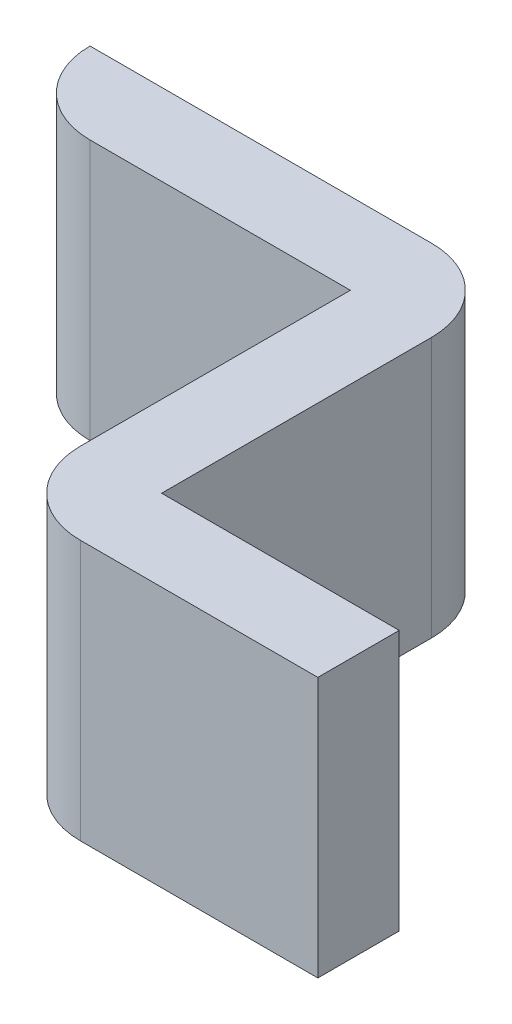
ISO-10303-21;
HEADER;
FILE_DESCRIPTION(('STEP AP214'),'2;1');
FILE_NAME('part.step','',(''),(''),'','','');
FILE_SCHEMA(('AUTOMOTIVE_DESIGN { 1 0 10303 214 1 1 1 1 }'));
ENDSEC;
DATA;
#1=APPLICATION_CONTEXT('core data for automotive mechanical design processes');
#2=APPLICATION_PROTOCOL_DEFINITION('international standard','automotive_design',2000,#1);
#3=PRODUCT_CONTEXT('',#1,'mechanical');
#4=PRODUCT('Part','Part','',(#3));
#5=PRODUCT_RELATED_PRODUCT_CATEGORY('part','',(#4));
#6=PRODUCT_DEFINITION_FORMATION('','',#4);
#7=PRODUCT_DEFINITION_CONTEXT('part definition',#1,'design');
#8=PRODUCT_DEFINITION('design','',#6,#7);
#9=PRODUCT_DEFINITION_SHAPE('','',#8);
#10=(LENGTH_UNIT() NAMED_UNIT(*) SI_UNIT(.MILLI.,.METRE.));
#11=(NAMED_UNIT(*) PLANE_ANGLE_UNIT() SI_UNIT($,.RADIAN.));
#12=(NAMED_UNIT(*) SI_UNIT($,.STERADIAN.) SOLID_ANGLE_UNIT());
#13=UNCERTAINTY_MEASURE_WITH_UNIT(LENGTH_MEASURE(1.E-05),#10,'distance_accuracy_value','');
#14=(GEOMETRIC_REPRESENTATION_CONTEXT(3) GLOBAL_UNCERTAINTY_ASSIGNED_CONTEXT((#13)) GLOBAL_UNIT_ASSIGNED_CONTEXT((#10,
#11,#12)) REPRESENTATION_CONTEXT('',''));
#15=CARTESIAN_POINT('',(0.,0.,0.));
#16=DIRECTION('',(0.,0.,1.));
#17=DIRECTION('',(1.,0.,0.));
#18=AXIS2_PLACEMENT_3D('',#15,#16,#17);
#19=CARTESIAN_POINT('',(1.175,-0.4,1.08));
#20=DIRECTION('',(-1.,0.,0.));
#21=DIRECTION('',(0.,0.,1.));
#22=AXIS2_PLACEMENT_3D('',#19,#20,#21);
#23=PLANE('',#22);
#24=DIRECTION('',(0.,-1.,0.));
#25=VECTOR('',#24,1.);
#26=CARTESIAN_POINT('',(1.175,-0.4,0.25));
#27=LINE('',#26,#25);
#28=CARTESIAN_POINT('',(1.175,0.4,0.25));
#29=VERTEX_POINT('',#28);
#30=CARTESIAN_POINT('',(1.175,-0.4,0.25));
#31=VERTEX_POINT('',#30);
#32=EDGE_CURVE('E83',#29,#31,#27,.T.);
#33=ORIENTED_EDGE('',*,*,#32,.F.);
#34=DIRECTION('',(0.,0.,-1.));
#35=VECTOR('',#34,1.);
#36=CARTESIAN_POINT('',(1.175,0.4,0.));
#37=LINE('',#36,#35);
#38=CARTESIAN_POINT('',(1.175,0.4,1.08));
#39=VERTEX_POINT('',#38);
#40=EDGE_CURVE('E80',#29,#39,#37,.F.);
#41=ORIENTED_EDGE('',*,*,#40,.T.);
#42=DIRECTION('',(0.,1.,0.));
#43=VECTOR('',#42,1.);
#44=CARTESIAN_POINT('',(1.175,-0.4,1.08));
#45=LINE('',#44,#43);
#46=CARTESIAN_POINT('',(1.175,-0.4,1.08));
#47=VERTEX_POINT('',#46);
#48=EDGE_CURVE('E148',#39,#47,#45,.F.);
#49=ORIENTED_EDGE('',*,*,#48,.T.);
#50=DIRECTION('',(0.,0.,-1.));
#51=VECTOR('',#50,1.);
#52=CARTESIAN_POINT('',(1.175,-0.4,0.));
#53=LINE('',#52,#51);
#54=EDGE_CURVE('E153',#31,#47,#53,.F.);
#55=ORIENTED_EDGE('',*,*,#54,.F.);
#56=EDGE_LOOP('',(#33,#41,#49,#55));
#57=FACE_BOUND('',#56,.T.);
#58=ADVANCED_FACE('F17',(#57),#23,.F.);
#59=CARTESIAN_POINT('',(1.905,-0.4,1.08));
#60=DIRECTION('',(0.,0.,1.));
#61=DIRECTION('',(1.,0.,0.));
#62=AXIS2_PLACEMENT_3D('',#59,#60,#61);
#63=PLANE('',#62);
#64=ORIENTED_EDGE('',*,*,#48,.F.);
#65=DIRECTION('',(1.,0.,0.));
#66=VECTOR('',#65,1.);
#67=CARTESIAN_POINT('',(-0.125,0.4,1.08));
#68=LINE('',#67,#66);
#69=CARTESIAN_POINT('',(1.905,0.4,1.08));
#70=VERTEX_POINT('',#69);
#71=EDGE_CURVE('E118',#39,#70,#68,.T.);
#72=ORIENTED_EDGE('',*,*,#71,.T.);
#73=DIRECTION('',(0.,1.,0.));
#74=VECTOR('',#73,1.);
#75=CARTESIAN_POINT('',(1.905,-0.4,1.08));
#76=LINE('',#75,#74);
#77=CARTESIAN_POINT('',(1.905,-0.4,1.08));
#78=VERTEX_POINT('',#77);
#79=EDGE_CURVE('E136',#70,#78,#76,.F.);
#80=ORIENTED_EDGE('',*,*,#79,.T.);
#81=DIRECTION('',(1.,0.,0.));
#82=VECTOR('',#81,1.);
#83=CARTESIAN_POINT('',(-0.125,-0.4,1.08));
#84=LINE('',#83,#82);
#85=EDGE_CURVE('E143',#47,#78,#84,.T.);
#86=ORIENTED_EDGE('',*,*,#85,.F.);
#87=EDGE_LOOP('',(#64,#72,#80,#86));
#88=FACE_BOUND('',#87,.T.);
#89=ADVANCED_FACE('F315',(#88),#63,.F.);
#90=CARTESIAN_POINT('',(1.905,-0.4,1.33));
#91=DIRECTION('',(-1.,0.,0.));
#92=DIRECTION('',(0.,0.,1.));
#93=AXIS2_PLACEMENT_3D('',#90,#91,#92);
#94=PLANE('',#93);
#95=ORIENTED_EDGE('',*,*,#79,.F.);
#96=DIRECTION('',(0.,0.,-1.));
#97=VECTOR('',#96,1.);
#98=CARTESIAN_POINT('',(1.905,0.4,0.));
#99=LINE('',#98,#97);
#100=CARTESIAN_POINT('',(1.905,0.4,1.33));
#101=VERTEX_POINT('',#100);
#102=EDGE_CURVE('E114',#70,#101,#99,.F.);
#103=ORIENTED_EDGE('',*,*,#102,.T.);
#104=DIRECTION('',(0.,1.,0.));
#105=VECTOR('',#104,1.);
#106=CARTESIAN_POINT('',(1.905,-0.4,1.33));
#107=LINE('',#106,#105);
#108=CARTESIAN_POINT('',(1.905,-0.4,1.33));
#109=VERTEX_POINT('',#108);
#110=EDGE_CURVE('E133',#101,#109,#107,.F.);
#111=ORIENTED_EDGE('',*,*,#110,.T.);
#112=DIRECTION('',(0.,0.,-1.));
#113=VECTOR('',#112,1.);
#114=CARTESIAN_POINT('',(1.905,-0.4,0.));
#115=LINE('',#114,#113);
#116=EDGE_CURVE('E139',#78,#109,#115,.F.);
#117=ORIENTED_EDGE('',*,*,#116,.F.);
#118=EDGE_LOOP('',(#95,#103,#111,#117));
#119=FACE_BOUND('',#118,.T.);
#120=ADVANCED_FACE('F192',(#119),#94,.F.);
#121=CARTESIAN_POINT('',(1.175,-0.4,1.33));
#122=DIRECTION('',(0.,0.,-1.));
#123=DIRECTION('',(-1.,0.,0.));
#124=AXIS2_PLACEMENT_3D('',#121,#122,#123);
#125=PLANE('',#124);
#126=ORIENTED_EDGE('',*,*,#110,.F.);
#127=DIRECTION('',(1.,0.,0.));
#128=VECTOR('',#127,1.);
#129=CARTESIAN_POINT('',(-0.125,0.4,1.33));
#130=LINE('',#129,#128);
#131=CARTESIAN_POINT('',(1.175,0.4,1.33));
#132=VERTEX_POINT('',#131);
#133=EDGE_CURVE('E111',#101,#132,#130,.F.);
#134=ORIENTED_EDGE('',*,*,#133,.T.);
#135=DIRECTION('',(0.,-1.,0.));
#136=VECTOR('',#135,1.);
#137=CARTESIAN_POINT('',(1.175,-0.4,1.33));
#138=LINE('',#137,#136);
#139=CARTESIAN_POINT('',(1.175,-0.4,1.33));
#140=VERTEX_POINT('',#139);
#141=EDGE_CURVE('E131',#140,#132,#138,.F.);
#142=ORIENTED_EDGE('',*,*,#141,.F.);
#143=DIRECTION('',(1.,0.,0.));
#144=VECTOR('',#143,1.);
#145=CARTESIAN_POINT('',(-0.125,-0.4,1.33));
#146=LINE('',#145,#144);
#147=EDGE_CURVE('E142',#109,#140,#146,.F.);
#148=ORIENTED_EDGE('',*,*,#147,.F.);
#149=EDGE_LOOP('',(#126,#134,#142,#148));
#150=FACE_BOUND('',#149,.T.);
#151=ADVANCED_FACE('F185',(#150),#125,.F.);
#152=CARTESIAN_POINT('',(1.175,-0.4,1.08));
#153=DIRECTION('',(0.,-1.,0.));
#154=DIRECTION('',(0.,0.,-1.));
#155=AXIS2_PLACEMENT_3D('',#152,#153,#154);
#156=CYLINDRICAL_SURFACE('',#155,0.25);
#157=CARTESIAN_POINT('',(1.175,0.4,1.08));
#158=DIRECTION('',(0.,-1.,0.));
#159=DIRECTION('',(0.,0.,-1.));
#160=AXIS2_PLACEMENT_3D('',#157,#158,#159);
#161=CIRCLE('',#160,0.25);
#162=CARTESIAN_POINT('',(0.925,0.4,1.08));
#163=VERTEX_POINT('',#162);
#164=EDGE_CURVE('E108',#132,#163,#161,.T.);
#165=ORIENTED_EDGE('',*,*,#164,.T.);
#166=DIRECTION('',(0.,1.,0.));
#167=VECTOR('',#166,1.);
#168=CARTESIAN_POINT('',(0.925,-0.4,1.08));
#169=LINE('',#168,#167);
#170=CARTESIAN_POINT('',(0.925,-0.4,1.08));
#171=VERTEX_POINT('',#170);
#172=EDGE_CURVE('E126',#163,#171,#169,.F.);
#173=ORIENTED_EDGE('',*,*,#172,.T.);
#174=CARTESIAN_POINT('',(1.175,-0.4,1.08));
#175=DIRECTION('',(0.,-1.,0.));
#176=DIRECTION('',(0.,0.,-1.));
#177=AXIS2_PLACEMENT_3D('',#174,#175,#176);
#178=CIRCLE('',#177,0.25);
#179=EDGE_CURVE('E169',#140,#171,#178,.T.);
#180=ORIENTED_EDGE('',*,*,#179,.F.);
#181=ORIENTED_EDGE('',*,*,#141,.T.);
#182=EDGE_LOOP('',(#165,#173,#180,#181));
#183=FACE_BOUND('',#182,.T.);
#184=ADVANCED_FACE('F176',(#183),#156,.T.);
#185=CARTESIAN_POINT('',(0.925,-0.4,0.25));
#186=DIRECTION('',(1.,0.,0.));
#187=DIRECTION('',(0.,0.,-1.));
#188=AXIS2_PLACEMENT_3D('',#185,#186,#187);
#189=PLANE('',#188);
#190=ORIENTED_EDGE('',*,*,#172,.F.);
#191=DIRECTION('',(0.,0.,-1.));
#192=VECTOR('',#191,1.);
#193=CARTESIAN_POINT('',(0.925,0.4,0.));
#194=LINE('',#193,#192);
#195=CARTESIAN_POINT('',(0.925,0.4,0.25));
#196=VERTEX_POINT('',#195);
#197=EDGE_CURVE('E103',#163,#196,#194,.T.);
#198=ORIENTED_EDGE('',*,*,#197,.T.);
#199=DIRECTION('',(0.,1.,0.));
#200=VECTOR('',#199,1.);
#201=CARTESIAN_POINT('',(0.925,-0.4,0.25));
#202=LINE('',#201,#200);
#203=CARTESIAN_POINT('',(0.925,-0.4,0.25));
#204=VERTEX_POINT('',#203);
#205=EDGE_CURVE('E123',#196,#204,#202,.F.);
#206=ORIENTED_EDGE('',*,*,#205,.T.);
#207=DIRECTION('',(0.,0.,-1.));
#208=VECTOR('',#207,1.);
#209=CARTESIAN_POINT('',(0.925,-0.4,0.));
#210=LINE('',#209,#208);
#211=EDGE_CURVE('E171',#171,#204,#210,.T.);
#212=ORIENTED_EDGE('',*,*,#211,.F.);
#213=EDGE_LOOP('',(#190,#198,#206,#212));
#214=FACE_BOUND('',#213,.T.);
#215=ADVANCED_FACE('F230',(#214),#189,.F.);
#216=CARTESIAN_POINT('',(0.125,-0.4,0.25));
#217=DIRECTION('',(0.,0.,-1.));
#218=DIRECTION('',(-1.,0.,0.));
#219=AXIS2_PLACEMENT_3D('',#216,#217,#218);
#220=PLANE('',#219);
#221=ORIENTED_EDGE('',*,*,#205,.F.);
#222=DIRECTION('',(1.,0.,0.));
#223=VECTOR('',#222,1.);
#224=CARTESIAN_POINT('',(-0.125,0.4,0.25));
#225=LINE('',#224,#223);
#226=CARTESIAN_POINT('',(0.125,0.4,0.25));
#227=VERTEX_POINT('',#226);
#228=EDGE_CURVE('E99',#196,#227,#225,.F.);
#229=ORIENTED_EDGE('',*,*,#228,.T.);
#230=DIRECTION('',(0.,-1.,0.));
#231=VECTOR('',#230,1.);
#232=CARTESIAN_POINT('',(0.125,-0.4,0.25));
#233=LINE('',#232,#231);
#234=CARTESIAN_POINT('',(0.125,-0.4,0.25));
#235=VERTEX_POINT('',#234);
#236=EDGE_CURVE('E102',#235,#227,#233,.F.);
#237=ORIENTED_EDGE('',*,*,#236,.F.);
#238=DIRECTION('',(1.,0.,0.));
#239=VECTOR('',#238,1.);
#240=CARTESIAN_POINT('',(-0.125,-0.4,0.25));
#241=LINE('',#240,#239);
#242=EDGE_CURVE('E95',#204,#235,#241,.F.);
#243=ORIENTED_EDGE('',*,*,#242,.F.);
#244=EDGE_LOOP('',(#221,#229,#237,#243));
#245=FACE_BOUND('',#244,.T.);
#246=ADVANCED_FACE('F228',(#245),#220,.F.);
#247=CARTESIAN_POINT('',(0.925,-0.4,0.25));
#248=DIRECTION('',(0.,-1.,0.));
#249=DIRECTION('',(0.,0.,-1.));
#250=AXIS2_PLACEMENT_3D('',#247,#248,#249);
#251=CYLINDRICAL_SURFACE('',#250,0.25);
#252=CARTESIAN_POINT('',(0.925,0.4,0.25));
#253=DIRECTION('',(0.,-1.,0.));
#254=DIRECTION('',(0.,0.,-1.));
#255=AXIS2_PLACEMENT_3D('',#252,#253,#254);
#256=CIRCLE('',#255,0.25);
#257=CARTESIAN_POINT('',(0.925,0.4,0.));
#258=VERTEX_POINT('',#257);
#259=EDGE_CURVE('E20',#258,#29,#256,.T.);
#260=ORIENTED_EDGE('',*,*,#259,.T.);
#261=ORIENTED_EDGE('',*,*,#32,.T.);
#262=CARTESIAN_POINT('',(0.925,-0.4,0.25));
#263=DIRECTION('',(0.,-1.,0.));
#264=DIRECTION('',(0.,0.,-1.));
#265=AXIS2_PLACEMENT_3D('',#262,#263,#264);
#266=CIRCLE('',#265,0.25);
#267=CARTESIAN_POINT('',(0.925,-0.4,0.));
#268=VERTEX_POINT('',#267);
#269=EDGE_CURVE('E93',#268,#31,#266,.T.);
#270=ORIENTED_EDGE('',*,*,#269,.F.);
#271=DIRECTION('',(0.,1.,0.));
#272=VECTOR('',#271,1.);
#273=CARTESIAN_POINT('',(0.925,-0.4,0.));
#274=LINE('',#273,#272);
#275=EDGE_CURVE('E87',#268,#258,#274,.T.);
#276=ORIENTED_EDGE('',*,*,#275,.T.);
#277=EDGE_LOOP('',(#260,#261,#270,#276));
#278=FACE_BOUND('',#277,.T.);
#279=ADVANCED_FACE('F91',(#278),#251,.T.);
#280=CARTESIAN_POINT('',(-0.125,0.4,0.));
#281=DIRECTION('',(0.,-1.,0.));
#282=DIRECTION('',(0.,0.,-1.));
#283=AXIS2_PLACEMENT_3D('',#280,#281,#282);
#284=PLANE('',#283);
#285=ORIENTED_EDGE('',*,*,#228,.F.);
#286=ORIENTED_EDGE('',*,*,#197,.F.);
#287=ORIENTED_EDGE('',*,*,#164,.F.);
#288=ORIENTED_EDGE('',*,*,#133,.F.);
#289=ORIENTED_EDGE('',*,*,#102,.F.);
#290=ORIENTED_EDGE('',*,*,#71,.F.);
#291=ORIENTED_EDGE('',*,*,#40,.F.);
#292=ORIENTED_EDGE('',*,*,#259,.F.);
#293=DIRECTION('',(1.,0.,0.));
#294=VECTOR('',#293,1.);
#295=CARTESIAN_POINT('',(0.925,0.4,0.));
#296=LINE('',#295,#294);
#297=CARTESIAN_POINT('',(-0.125,0.4,0.));
#298=VERTEX_POINT('',#297);
#299=EDGE_CURVE('E77',#258,#298,#296,.F.);
#300=ORIENTED_EDGE('',*,*,#299,.T.);
#301=CARTESIAN_POINT('',(0.125,0.4,0.));
#302=DIRECTION('',(0.,-1.,0.));
#303=DIRECTION('',(0.,0.,-1.));
#304=AXIS2_PLACEMENT_3D('',#301,#302,#303);
#305=CIRCLE('',#304,0.25);
#306=EDGE_CURVE('E122',#227,#298,#305,.T.);
#307=ORIENTED_EDGE('',*,*,#306,.F.);
#308=EDGE_LOOP('',(#285,#286,#287,#288,#289,#290,#291,#292,#300,#307));
#309=FACE_BOUND('',#308,.T.);
#310=ADVANCED_FACE('F75',(#309),#284,.F.);
#311=CARTESIAN_POINT('',(0.125,-0.4,0.));
#312=DIRECTION('',(0.,-1.,0.));
#313=DIRECTION('',(0.,0.,-1.));
#314=AXIS2_PLACEMENT_3D('',#311,#312,#313);
#315=CYLINDRICAL_SURFACE('',#314,0.25);
#316=ORIENTED_EDGE('',*,*,#306,.T.);
#317=DIRECTION('',(0.,1.,0.));
#318=VECTOR('',#317,1.);
#319=CARTESIAN_POINT('',(-0.125,-0.4,0.));
#320=LINE('',#319,#318);
#321=CARTESIAN_POINT('',(-0.125,-0.4,0.));
#322=VERTEX_POINT('',#321);
#323=EDGE_CURVE('E26',#298,#322,#320,.F.);
#324=ORIENTED_EDGE('',*,*,#323,.T.);
#325=CARTESIAN_POINT('',(0.125,-0.4,0.));
#326=DIRECTION('',(0.,-1.,0.));
#327=DIRECTION('',(0.,0.,-1.));
#328=AXIS2_PLACEMENT_3D('',#325,#326,#327);
#329=CIRCLE('',#328,0.25);
#330=EDGE_CURVE('E34',#235,#322,#329,.T.);
#331=ORIENTED_EDGE('',*,*,#330,.F.);
#332=ORIENTED_EDGE('',*,*,#236,.T.);
#333=EDGE_LOOP('',(#316,#324,#331,#332));
#334=FACE_BOUND('',#333,.T.);
#335=ADVANCED_FACE('F210',(#334),#315,.T.);
#336=CARTESIAN_POINT('',(-0.125,-0.4,0.));
#337=DIRECTION('',(0.,-1.,0.));
#338=DIRECTION('',(0.,0.,-1.));
#339=AXIS2_PLACEMENT_3D('',#336,#337,#338);
#340=PLANE('',#339);
#341=ORIENTED_EDGE('',*,*,#242,.T.);
#342=ORIENTED_EDGE('',*,*,#330,.T.);
#343=DIRECTION('',(1.,0.,0.));
#344=VECTOR('',#343,1.);
#345=CARTESIAN_POINT('',(0.925,-0.4,0.));
#346=LINE('',#345,#344);
#347=EDGE_CURVE('E11',#322,#268,#346,.T.);
#348=ORIENTED_EDGE('',*,*,#347,.T.);
#349=ORIENTED_EDGE('',*,*,#269,.T.);
#350=ORIENTED_EDGE('',*,*,#54,.T.);
#351=ORIENTED_EDGE('',*,*,#85,.T.);
#352=ORIENTED_EDGE('',*,*,#116,.T.);
#353=ORIENTED_EDGE('',*,*,#147,.T.);
#354=ORIENTED_EDGE('',*,*,#179,.T.);
#355=ORIENTED_EDGE('',*,*,#211,.T.);
#356=EDGE_LOOP('',(#341,#342,#348,#349,#350,#351,#352,#353,#354,#355));
#357=FACE_BOUND('',#356,.T.);
#358=ADVANCED_FACE('F208',(#357),#340,.T.);
#359=CARTESIAN_POINT('',(0.925,-0.4,0.));
#360=DIRECTION('',(0.,0.,1.));
#361=DIRECTION('',(1.,0.,0.));
#362=AXIS2_PLACEMENT_3D('',#359,#360,#361);
#363=PLANE('',#362);
#364=ORIENTED_EDGE('',*,*,#323,.F.);
#365=ORIENTED_EDGE('',*,*,#299,.F.);
#366=ORIENTED_EDGE('',*,*,#275,.F.);
#367=ORIENTED_EDGE('',*,*,#347,.F.);
#368=EDGE_LOOP('',(#364,#365,#366,#367));
#369=FACE_BOUND('',#368,.T.);
#370=ADVANCED_FACE('F86',(#369),#363,.F.);
#371=CLOSED_SHELL('',(#58,#89,#120,#151,#184,#215,#246,#279,#310,#335,#358,#370));
#372=MANIFOLD_SOLID_BREP('B1',#371);
#373=ADVANCED_BREP_SHAPE_REPRESENTATION('',(#18,#372),#14);
#374=SHAPE_DEFINITION_REPRESENTATION(#9,#373);
ENDSEC;
END-ISO-10303-21;
